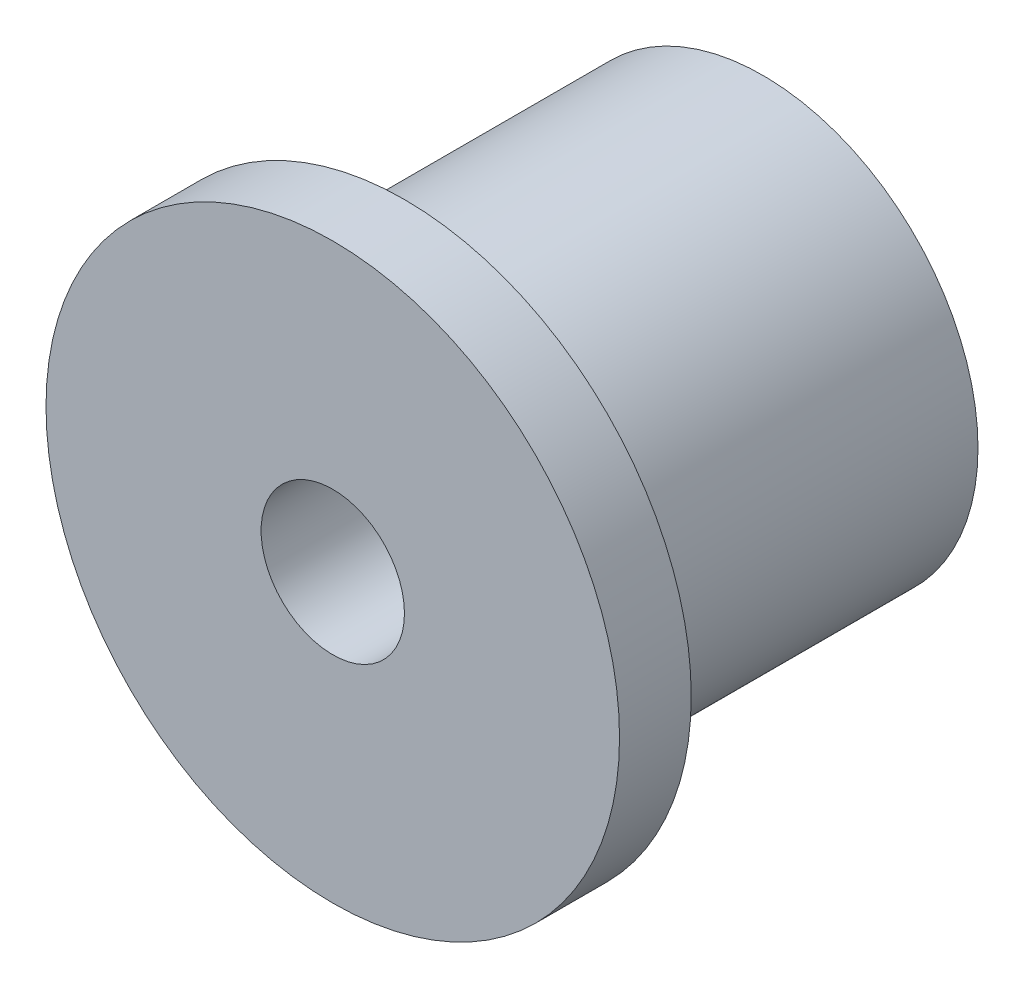
ISO-10303-21;
HEADER;
FILE_DESCRIPTION(('STEP AP214'),'2;1');
FILE_NAME('part.step','',(''),(''),'','','');
FILE_SCHEMA(('AUTOMOTIVE_DESIGN { 1 0 10303 214 1 1 1 1 }'));
ENDSEC;
DATA;
#1=APPLICATION_CONTEXT('core data for automotive mechanical design processes');
#2=APPLICATION_PROTOCOL_DEFINITION('international standard','automotive_design',2000,#1);
#3=PRODUCT_CONTEXT('',#1,'mechanical');
#4=PRODUCT('Part','Part','',(#3));
#5=PRODUCT_RELATED_PRODUCT_CATEGORY('part','',(#4));
#6=PRODUCT_DEFINITION_FORMATION('','',#4);
#7=PRODUCT_DEFINITION_CONTEXT('part definition',#1,'design');
#8=PRODUCT_DEFINITION('design','',#6,#7);
#9=PRODUCT_DEFINITION_SHAPE('','',#8);
#10=(LENGTH_UNIT() NAMED_UNIT(*) SI_UNIT(.MILLI.,.METRE.));
#11=(NAMED_UNIT(*) PLANE_ANGLE_UNIT() SI_UNIT($,.RADIAN.));
#12=(NAMED_UNIT(*) SI_UNIT($,.STERADIAN.) SOLID_ANGLE_UNIT());
#13=UNCERTAINTY_MEASURE_WITH_UNIT(LENGTH_MEASURE(1.E-05),#10,'distance_accuracy_value','');
#14=(GEOMETRIC_REPRESENTATION_CONTEXT(3) GLOBAL_UNCERTAINTY_ASSIGNED_CONTEXT((#13)) GLOBAL_UNIT_ASSIGNED_CONTEXT((#10,
#11,#12)) REPRESENTATION_CONTEXT('',''));
#15=CARTESIAN_POINT('',(0.,0.,0.));
#16=DIRECTION('',(0.,0.,1.));
#17=DIRECTION('',(1.,0.,0.));
#18=AXIS2_PLACEMENT_3D('',#15,#16,#17);
#19=CARTESIAN_POINT('',(0.,0.,25.));
#20=DIRECTION('',(0.,0.,-1.));
#21=DIRECTION('',(-1.,0.,0.));
#22=AXIS2_PLACEMENT_3D('',#19,#20,#21);
#23=CYLINDRICAL_SURFACE('',#22,100.);
#24=CARTESIAN_POINT('',(0.,0.,25.));
#25=DIRECTION('',(0.,0.,1.));
#26=DIRECTION('',(1.,0.,0.));
#27=AXIS2_PLACEMENT_3D('',#24,#25,#26);
#28=CIRCLE('',#27,100.);
#29=CARTESIAN_POINT('',(100.,0.,25.));
#30=VERTEX_POINT('',#29);
#31=EDGE_CURVE('E38',#30,#30,#28,.T.);
#32=ORIENTED_EDGE('',*,*,#31,.F.);
#33=EDGE_LOOP('',(#32));
#34=FACE_BOUND('',#33,.T.);
#35=CARTESIAN_POINT('',(0.,0.,0.));
#36=DIRECTION('',(0.,0.,1.));
#37=DIRECTION('',(1.,0.,0.));
#38=AXIS2_PLACEMENT_3D('',#35,#36,#37);
#39=CIRCLE('',#38,100.);
#40=CARTESIAN_POINT('',(100.,0.,0.));
#41=VERTEX_POINT('',#40);
#42=EDGE_CURVE('E34',#41,#41,#39,.T.);
#43=ORIENTED_EDGE('',*,*,#42,.T.);
#44=EDGE_LOOP('',(#43));
#45=FACE_BOUND('',#44,.T.);
#46=ADVANCED_FACE('F31',(#34,#45),#23,.T.);
#47=CARTESIAN_POINT('',(0.,0.,25.));
#48=DIRECTION('',(0.,0.,-1.));
#49=DIRECTION('',(-1.,0.,0.));
#50=AXIS2_PLACEMENT_3D('',#47,#48,#49);
#51=CYLINDRICAL_SURFACE('',#50,25.);
#52=CARTESIAN_POINT('',(0.,0.,25.));
#53=DIRECTION('',(0.,0.,1.));
#54=DIRECTION('',(1.,0.,0.));
#55=AXIS2_PLACEMENT_3D('',#52,#53,#54);
#56=CIRCLE('',#55,25.);
#57=CARTESIAN_POINT('',(25.,0.,25.));
#58=VERTEX_POINT('',#57);
#59=EDGE_CURVE('E10',#58,#58,#56,.T.);
#60=ORIENTED_EDGE('',*,*,#59,.T.);
#61=EDGE_LOOP('',(#60));
#62=FACE_BOUND('',#61,.T.);
#63=CARTESIAN_POINT('',(0.,0.,-125.));
#64=DIRECTION('',(0.,0.,1.));
#65=DIRECTION('',(1.,0.,0.));
#66=AXIS2_PLACEMENT_3D('',#63,#64,#65);
#67=CIRCLE('',#66,25.);
#68=CARTESIAN_POINT('',(25.,0.,-125.));
#69=VERTEX_POINT('',#68);
#70=EDGE_CURVE('E47',#69,#69,#67,.T.);
#71=ORIENTED_EDGE('',*,*,#70,.F.);
#72=EDGE_LOOP('',(#71));
#73=FACE_BOUND('',#72,.T.);
#74=ADVANCED_FACE('F57',(#62,#73),#51,.F.);
#75=CARTESIAN_POINT('',(0.,0.,25.));
#76=DIRECTION('',(0.,0.,1.));
#77=DIRECTION('',(1.,0.,0.));
#78=AXIS2_PLACEMENT_3D('',#75,#76,#77);
#79=PLANE('',#78);
#80=ORIENTED_EDGE('',*,*,#31,.T.);
#81=EDGE_LOOP('',(#80));
#82=FACE_BOUND('',#81,.T.);
#83=ORIENTED_EDGE('',*,*,#59,.F.);
#84=EDGE_LOOP('',(#83));
#85=FACE_BOUND('',#84,.T.);
#86=ADVANCED_FACE('F59',(#82,#85),#79,.T.);
#87=CARTESIAN_POINT('',(0.,0.,0.));
#88=DIRECTION('',(0.,0.,1.));
#89=DIRECTION('',(1.,0.,0.));
#90=AXIS2_PLACEMENT_3D('',#87,#88,#89);
#91=PLANE('',#90);
#92=CARTESIAN_POINT('',(0.,0.,0.));
#93=DIRECTION('',(0.,0.,1.));
#94=DIRECTION('',(1.,0.,0.));
#95=AXIS2_PLACEMENT_3D('',#92,#93,#94);
#96=CIRCLE('',#95,75.);
#97=CARTESIAN_POINT('',(75.,0.,0.));
#98=VERTEX_POINT('',#97);
#99=EDGE_CURVE('E44',#98,#98,#96,.T.);
#100=ORIENTED_EDGE('',*,*,#99,.T.);
#101=EDGE_LOOP('',(#100));
#102=FACE_BOUND('',#101,.T.);
#103=ORIENTED_EDGE('',*,*,#42,.F.);
#104=EDGE_LOOP('',(#103));
#105=FACE_BOUND('',#104,.T.);
#106=ADVANCED_FACE('F64',(#102,#105),#91,.F.);
#107=CARTESIAN_POINT('',(0.,0.,-125.));
#108=DIRECTION('',(0.,0.,1.));
#109=DIRECTION('',(1.,0.,0.));
#110=AXIS2_PLACEMENT_3D('',#107,#108,#109);
#111=CYLINDRICAL_SURFACE('',#110,75.);
#112=CARTESIAN_POINT('',(0.,0.,-125.));
#113=DIRECTION('',(0.,0.,1.));
#114=DIRECTION('',(1.,0.,0.));
#115=AXIS2_PLACEMENT_3D('',#112,#113,#114);
#116=CIRCLE('',#115,75.);
#117=CARTESIAN_POINT('',(75.,0.,-125.));
#118=VERTEX_POINT('',#117);
#119=EDGE_CURVE('E48',#118,#118,#116,.T.);
#120=ORIENTED_EDGE('',*,*,#119,.T.);
#121=EDGE_LOOP('',(#120));
#122=FACE_BOUND('',#121,.T.);
#123=ORIENTED_EDGE('',*,*,#99,.F.);
#124=EDGE_LOOP('',(#123));
#125=FACE_BOUND('',#124,.T.);
#126=ADVANCED_FACE('F70',(#122,#125),#111,.T.);
#127=CARTESIAN_POINT('',(0.,0.,-125.));
#128=DIRECTION('',(0.,0.,1.));
#129=DIRECTION('',(1.,0.,0.));
#130=AXIS2_PLACEMENT_3D('',#127,#128,#129);
#131=PLANE('',#130);
#132=ORIENTED_EDGE('',*,*,#70,.T.);
#133=EDGE_LOOP('',(#132));
#134=FACE_BOUND('',#133,.T.);
#135=ORIENTED_EDGE('',*,*,#119,.F.);
#136=EDGE_LOOP('',(#135));
#137=FACE_BOUND('',#136,.T.);
#138=ADVANCED_FACE('F54',(#134,#137),#131,.F.);
#139=CLOSED_SHELL('',(#46,#74,#86,#106,#126,#138));
#140=MANIFOLD_SOLID_BREP('B2',#139);
#141=ADVANCED_BREP_SHAPE_REPRESENTATION('',(#18,#140),#14);
#142=SHAPE_DEFINITION_REPRESENTATION(#9,#141);
ENDSEC;
END-ISO-10303-21;
